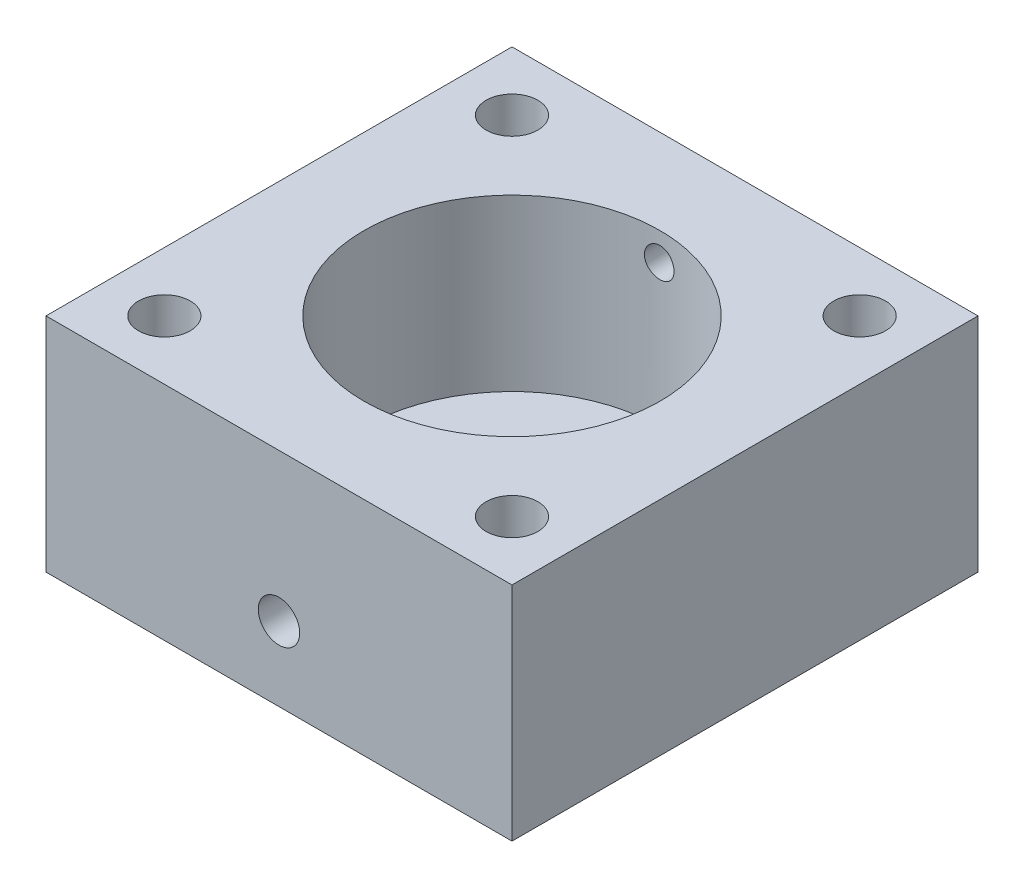
ISO-10303-21;
HEADER;
FILE_DESCRIPTION(('STEP AP214'),'2;1');
FILE_NAME('part.step','',(''),(''),'','','');
FILE_SCHEMA(('AUTOMOTIVE_DESIGN { 1 0 10303 214 1 1 1 1 }'));
ENDSEC;
DATA;
#1=APPLICATION_CONTEXT('core data for automotive mechanical design processes');
#2=APPLICATION_PROTOCOL_DEFINITION('international standard','automotive_design',2000,#1);
#3=PRODUCT_CONTEXT('',#1,'mechanical');
#4=PRODUCT('Part','Part','',(#3));
#5=PRODUCT_RELATED_PRODUCT_CATEGORY('part','',(#4));
#6=PRODUCT_DEFINITION_FORMATION('','',#4);
#7=PRODUCT_DEFINITION_CONTEXT('part definition',#1,'design');
#8=PRODUCT_DEFINITION('design','',#6,#7);
#9=PRODUCT_DEFINITION_SHAPE('','',#8);
#10=(LENGTH_UNIT() NAMED_UNIT(*) SI_UNIT(.MILLI.,.METRE.));
#11=(NAMED_UNIT(*) PLANE_ANGLE_UNIT() SI_UNIT($,.RADIAN.));
#12=(NAMED_UNIT(*) SI_UNIT($,.STERADIAN.) SOLID_ANGLE_UNIT());
#13=UNCERTAINTY_MEASURE_WITH_UNIT(LENGTH_MEASURE(1.E-05),#10,'distance_accuracy_value','');
#14=(GEOMETRIC_REPRESENTATION_CONTEXT(3) GLOBAL_UNCERTAINTY_ASSIGNED_CONTEXT((#13)) GLOBAL_UNIT_ASSIGNED_CONTEXT((#10,
#11,#12)) REPRESENTATION_CONTEXT('',''));
#15=CARTESIAN_POINT('',(0.,0.,0.));
#16=DIRECTION('',(0.,0.,1.));
#17=DIRECTION('',(1.,0.,0.));
#18=AXIS2_PLACEMENT_3D('',#15,#16,#17);
#19=CARTESIAN_POINT('',(0.,13.1236832670913,15.751));
#20=DIRECTION('',(0.,0.,-1.));
#21=DIRECTION('',(-1.,0.,0.));
#22=AXIS2_PLACEMENT_3D('',#19,#20,#21);
#23=CYLINDRICAL_SURFACE('',#22,1.);
#24=CARTESIAN_POINT('',(-1.,13.1236832670913,-9.9498743710662));
#25=CARTESIAN_POINT('',(-0.999997573393512,13.0676637029177,-9.94987502796903));
#26=CARTESIAN_POINT('',(-0.995276858982475,13.0116070986795,-9.95035256994218));
#27=CARTESIAN_POINT('',(-0.976516314763562,12.9010480807978,-9.95221087558119));
#28=CARTESIAN_POINT('',(-0.962466214886435,12.8465474490539,-9.95359263461219));
#29=CARTESIAN_POINT('',(-0.925460116068927,12.7407174478734,-9.95710133047387));
#30=CARTESIAN_POINT('',(-0.902509516293899,12.6893861776999,-9.9592278154679));
#31=CARTESIAN_POINT('',(-0.848364267391102,12.5913154747996,-9.9639858057182));
#32=CARTESIAN_POINT('',(-0.817171255625927,12.5445751326076,-9.96661721064329));
#33=CARTESIAN_POINT('',(-0.747304761998705,12.4568320034338,-9.97209926709899));
#34=CARTESIAN_POINT('',(-0.708607418108261,12.4158482575876,-9.97495060005266));
#35=CARTESIAN_POINT('',(-0.624881715319565,12.3409456580878,-9.98054505235719));
#36=CARTESIAN_POINT('',(-0.579853066906569,12.307027127685,-9.98328816675213));
#37=CARTESIAN_POINT('',(-0.484626361650988,12.2471520100842,-9.98836383155605));
#38=CARTESIAN_POINT('',(-0.43441766252957,12.2212122682977,-9.99069550894647));
#39=CARTESIAN_POINT('',(-0.330329984287511,12.1781388339427,-9.9946781687577));
#40=CARTESIAN_POINT('',(-0.27645109466822,12.1610049267219,-9.99632916777064));
#41=CARTESIAN_POINT('',(-0.16674478274295,12.1360853577381,-9.99875966571026));
#42=CARTESIAN_POINT('',(-0.110924527031582,12.1282684343414,-9.99954207842817));
#43=CARTESIAN_POINT('',(0.00124074068894253,12.1221079979576,-10.0001571559869));
#44=CARTESIAN_POINT('',(0.0575857390544608,12.1237642393451,-9.99998984545273));
#45=CARTESIAN_POINT('',(0.16898884406456,12.1364777397415,-9.99872671311186));
#46=CARTESIAN_POINT('',(0.224050829934979,12.1475013826552,-9.99763421151713));
#47=CARTESIAN_POINT('',(0.331539179504533,12.178584396038,-9.9946472926493));
#48=CARTESIAN_POINT('',(0.383965508957729,12.1986438838789,-9.99275286495953));
#49=CARTESIAN_POINT('',(0.484800314679586,12.2472660303458,-9.98836937483915));
#50=CARTESIAN_POINT('',(0.533201570981649,12.2758435646215,-9.98587927365758));
#51=CARTESIAN_POINT('',(0.624533513174193,12.3406797904277,-9.98058384519407));
#52=CARTESIAN_POINT('',(0.667464038560827,12.3769387072365,-9.97777850866811));
#53=CARTESIAN_POINT('',(0.746832771822689,12.456297496605,-9.97215293467852));
#54=CARTESIAN_POINT('',(0.783241746190345,12.4994266118329,-9.96933268573028));
#55=CARTESIAN_POINT('',(0.848307535357918,12.5912001323021,-9.96400739928222));
#56=CARTESIAN_POINT('',(0.87696433891289,12.6398445455435,-9.96150236223964));
#57=CARTESIAN_POINT('',(0.92571218457323,12.7412902922911,-9.95709089514149));
#58=CARTESIAN_POINT('',(0.94580142057296,12.7940924995142,-9.95518459132555));
#59=CARTESIAN_POINT('',(0.97682073563759,12.902343871706,-9.95218901870938));
#60=CARTESIAN_POINT('',(0.987751093743034,12.9577929559788,-9.95109972501768));
#61=CARTESIAN_POINT('',(1.00010477539196,13.0695074466209,-9.94986580527417));
#62=CARTESIAN_POINT('',(1.00156899664721,13.1257682873562,-9.94971711547603));
#63=CARTESIAN_POINT('',(0.995056246871362,13.2377345329142,-9.95037051354771));
#64=CARTESIAN_POINT('',(0.987079403409754,13.2934399452317,-9.95117258857061));
#65=CARTESIAN_POINT('',(0.96194517450752,13.4025948493697,-9.95363344422402));
#66=CARTESIAN_POINT('',(0.944807127188908,13.456048838186,-9.95529042001345));
#67=CARTESIAN_POINT('',(0.90185671967594,13.5593233188217,-9.95927291038794));
#68=CARTESIAN_POINT('',(0.876044160783588,13.6091437273785,-9.9615984402867));
#69=CARTESIAN_POINT('',(0.816375001423217,13.7039232411201,-9.96666584355714));
#70=CARTESIAN_POINT('',(0.782491299840691,13.7488652090576,-9.96940910814672));
#71=CARTESIAN_POINT('',(0.707680533451174,13.8324383203654,-9.97499832625186));
#72=CARTESIAN_POINT('',(0.666753294248134,13.8710693074314,-9.97784428230866));
#73=CARTESIAN_POINT('',(0.578839804226474,13.9410649004894,-9.98333047849302));
#74=CARTESIAN_POINT('',(0.531832255969452,13.9724028266776,-9.98596994055474));
#75=CARTESIAN_POINT('',(0.433197717417132,14.0267391355978,-9.99073442106631));
#76=CARTESIAN_POINT('',(0.381570790429626,14.0497376325985,-9.99285944656492));
#77=CARTESIAN_POINT('',(0.275256126432816,14.0866970347467,-9.99635210414006));
#78=CARTESIAN_POINT('',(0.22057403764996,14.1006740544166,-9.99772108605649));
#79=CARTESIAN_POINT('',(0.109624813983679,14.1192463366712,-9.99955294613649));
#80=CARTESIAN_POINT('',(0.0533577236922176,14.1238418629254,-10.0000158497656));
#81=CARTESIAN_POINT('',(-0.0589022240757468,14.1235170006514,-9.99998338313269));
#82=CARTESIAN_POINT('',(-0.114895207224528,14.1186380302547,-9.99949218376669));
#83=CARTESIAN_POINT('',(-0.225261888356363,14.0995895214344,-9.99761493577591));
#84=CARTESIAN_POINT('',(-0.279635585068366,14.0854199757184,-9.99622888644873));
#85=CARTESIAN_POINT('',(-0.385219908767743,14.0482040096984,-9.99271723813962));
#86=CARTESIAN_POINT('',(-0.436430966077528,14.0251588001572,-9.99059174003249));
#87=CARTESIAN_POINT('',(-0.534264600154796,13.9708500981744,-9.98583812416296));
#88=CARTESIAN_POINT('',(-0.580887203768559,13.9395866538202,-9.98321000934154));
#89=CARTESIAN_POINT('',(-0.668432724426939,13.8695736480676,-9.97773184669055));
#90=CARTESIAN_POINT('',(-0.709330926219341,13.8307932508465,-9.97488091460699));
#91=CARTESIAN_POINT('',(-0.784057759393143,13.7469079155459,-9.96928590769659));
#92=CARTESIAN_POINT('',(-0.817884691847847,13.7018014619223,-9.96654185867777));
#93=CARTESIAN_POINT('',(-0.877576640424053,13.6064189251714,-9.96146383410601));
#94=CARTESIAN_POINT('',(-0.903421187994835,13.5561299857673,-9.95913091925306));
#95=CARTESIAN_POINT('',(-0.946264708098769,13.4519349758451,-9.95515194762462));
#96=CARTESIAN_POINT('',(-0.963273657889858,13.3980330631656,-9.95350511653359));
#97=CARTESIAN_POINT('',(-0.983721688333529,13.3071355261922,-9.95150007538145));
#98=CARTESIAN_POINT('',(-0.989817712398224,13.2707210157849,-9.95089331935694));
#99=CARTESIAN_POINT('',(-0.997957658605114,13.1974374440488,-9.95008025177663));
#100=CARTESIAN_POINT('',(-1.00000159775726,13.1605683846288,-9.94987393853984));
#101=CARTESIAN_POINT('',(-1.,13.1236832670913,-9.9498743710662));
#102=B_SPLINE_CURVE_WITH_KNOTS('',3,(#24,#25,#26,#27,#28,#29,#30,#31,#32,#33,#34,#35,#36,#37,
#38,#39,#40,#41,#42,#43,#44,#45,#46,#47,#48,#49,#50,#51,#52,#53,#54,#55,#56,#57,#58,#59,#60,#61,
#62,#63,#64,#65,#66,#67,#68,#69,#70,#71,#72,#73,#74,#75,#76,#77,#78,#79,#80,#81,#82,#83,#84,#85,
#86,#87,#88,#89,#90,#91,#92,#93,#94,#95,#96,#97,#98,#99,#100,#101),.UNSPECIFIED.,.T.,.F.,(4,2,2,
2,2,2,2,2,2,2,2,2,2,2,2,2,2,2,2,2,2,2,2,2,2,2,2,2,2,2,2,2,2,2,2,2,2,2,4),(0.,0.167923994436462,
0.336033151821769,0.504040490997473,0.672014480421314,0.840531615299249,1.00905645855253,
1.17793469971292,1.34680882407795,1.5151147089845,1.68341622998232,1.85111631818662,
2.01881858480974,2.18681545466413,2.35481725218529,2.52355425085001,2.69229149427563,
2.86106429117934,3.02983194595033,3.19786996307765,3.3659057096687,3.53358814704527,
3.70127442561047,3.86953189811718,4.03779353723203,4.20666136818118,4.37552688518005,
4.54408992694361,4.71264823113149,4.88047133468483,5.04829456996658,5.21609491995246,
5.38389428810799,5.55239715037988,5.72094045034525,5.88991241070476,6.05869314894001,
6.16926027606046,6.27982693903815),.UNSPECIFIED.);
#103=CARTESIAN_POINT('',(-1.,13.1236832670913,-9.9498743710662));
#104=VERTEX_POINT('',#103);
#105=EDGE_CURVE('E117',#104,#104,#102,.T.);
#106=ORIENTED_EDGE('',*,*,#105,.T.);
#107=EDGE_LOOP('',(#106));
#108=FACE_BOUND('',#107,.T.);
#109=CARTESIAN_POINT('',(0.,13.1236832670913,-13.2499999999999));
#110=DIRECTION('',(0.,0.,-1.));
#111=DIRECTION('',(-1.,0.,0.));
#112=AXIS2_PLACEMENT_3D('',#109,#110,#111);
#113=CIRCLE('',#112,1.);
#114=CARTESIAN_POINT('',(-1.,13.1236832670913,-13.2499999999999));
#115=VERTEX_POINT('',#114);
#116=EDGE_CURVE('E41',#115,#115,#113,.F.);
#117=ORIENTED_EDGE('',*,*,#116,.F.);
#118=EDGE_LOOP('',(#117));
#119=FACE_BOUND('',#118,.T.);
#120=ADVANCED_FACE('F37',(#108,#119),#23,.F.);
#121=CARTESIAN_POINT('',(0.,5.,-15.7509999999999));
#122=DIRECTION('',(0.,0.,1.));
#123=DIRECTION('',(1.,0.,0.));
#124=AXIS2_PLACEMENT_3D('',#121,#122,#123);
#125=CYLINDRICAL_SURFACE('',#124,1.);
#126=CARTESIAN_POINT('',(1.,5.,9.9498743710662));
#127=CARTESIAN_POINT('',(0.999997573393512,4.9439804358264,9.94987502796903));
#128=CARTESIAN_POINT('',(0.995276858982475,4.88792383158816,9.95035256994218));
#129=CARTESIAN_POINT('',(0.976516314763562,4.77736481370647,9.95221087558119));
#130=CARTESIAN_POINT('',(0.962466214886435,4.72286418196251,9.95359263461219));
#131=CARTESIAN_POINT('',(0.925460116068926,4.61703418078209,9.95710133047387));
#132=CARTESIAN_POINT('',(0.902509516293899,4.56570291060856,9.9592278154679));
#133=CARTESIAN_POINT('',(0.848364267391101,4.46763220770825,9.9639858057182));
#134=CARTESIAN_POINT('',(0.817171255625926,4.42089186551628,9.96661721064329));
#135=CARTESIAN_POINT('',(0.747304761998704,4.3331487363425,9.97209926709899));
#136=CARTESIAN_POINT('',(0.708607418108259,4.29216499049622,9.97495060005266));
#137=CARTESIAN_POINT('',(0.624881715319564,4.21726239099643,9.98054505235719));
#138=CARTESIAN_POINT('',(0.579853066906569,4.18334386059369,9.98328816675213));
#139=CARTESIAN_POINT('',(0.484626361650988,4.12346874299285,9.98836383155605));
#140=CARTESIAN_POINT('',(0.434417662529569,4.09752900120634,9.99069550894647));
#141=CARTESIAN_POINT('',(0.33032998428751,4.05445556685132,9.99467816875771));
#142=CARTESIAN_POINT('',(0.276451094668219,4.03732165963053,9.99632916777064));
#143=CARTESIAN_POINT('',(0.16674478274295,4.01240209064675,9.99875966571026));
#144=CARTESIAN_POINT('',(0.110924527031581,4.00458516725005,9.99954207842817));
#145=CARTESIAN_POINT('',(-0.00124074068894321,3.99842473086628,10.0001571559869));
#146=CARTESIAN_POINT('',(-0.0575857390544615,4.00008097225373,9.99998984545273));
#147=CARTESIAN_POINT('',(-0.16898884406456,4.01279447265016,9.99872671311186));
#148=CARTESIAN_POINT('',(-0.224050829934979,4.02381811556389,9.99763421151713));
#149=CARTESIAN_POINT('',(-0.331539179504533,4.05490112894662,9.9946472926493));
#150=CARTESIAN_POINT('',(-0.383965508957729,4.07496061678757,9.99275286495953));
#151=CARTESIAN_POINT('',(-0.484800314679586,4.12358276325444,9.98836937483915));
#152=CARTESIAN_POINT('',(-0.53320157098165,4.15216029753016,9.98587927365758));
#153=CARTESIAN_POINT('',(-0.624533513174194,4.21699652333637,9.98058384519407));
#154=CARTESIAN_POINT('',(-0.667464038560828,4.25325544014518,9.97777850866811));
#155=CARTESIAN_POINT('',(-0.746832771822689,4.33261422951365,9.97215293467852));
#156=CARTESIAN_POINT('',(-0.783241746190344,4.37574334474158,9.96933268573028));
#157=CARTESIAN_POINT('',(-0.848307535357917,4.46751686521078,9.96400739928222));
#158=CARTESIAN_POINT('',(-0.876964338912889,4.51616127845214,9.96150236223964));
#159=CARTESIAN_POINT('',(-0.92571218457323,4.61760702519979,9.95709089514149));
#160=CARTESIAN_POINT('',(-0.94580142057296,4.67040923242289,9.95518459132555));
#161=CARTESIAN_POINT('',(-0.976820735637589,4.77866060461469,9.95218901870938));
#162=CARTESIAN_POINT('',(-0.987751093743033,4.83410968888744,9.95109972501768));
#163=CARTESIAN_POINT('',(-1.00010477539196,4.94582417952951,9.94986580527417));
#164=CARTESIAN_POINT('',(-1.00156899664721,5.00208502026483,9.94971711547603));
#165=CARTESIAN_POINT('',(-0.995056246871362,5.11405126582286,9.95037051354771));
#166=CARTESIAN_POINT('',(-0.987079403409754,5.16975667814037,9.95117258857061));
#167=CARTESIAN_POINT('',(-0.961945174507519,5.27891158227834,9.95363344422402));
#168=CARTESIAN_POINT('',(-0.944807127188908,5.33236557109466,9.95529042001345));
#169=CARTESIAN_POINT('',(-0.901856719675939,5.43564005173031,9.95927291038795));
#170=CARTESIAN_POINT('',(-0.876044160783587,5.48546046028718,9.9615984402867));
#171=CARTESIAN_POINT('',(-0.816375001423217,5.58023997402878,9.96666584355714));
#172=CARTESIAN_POINT('',(-0.782491299840691,5.62518194196625,9.96940910814672));
#173=CARTESIAN_POINT('',(-0.707680533451174,5.70875505327407,9.97499832625186));
#174=CARTESIAN_POINT('',(-0.666753294248134,5.74738604034008,9.97784428230866));
#175=CARTESIAN_POINT('',(-0.578839804226473,5.81738163339809,9.98333047849302));
#176=CARTESIAN_POINT('',(-0.531832255969451,5.84871955958622,9.98596994055474));
#177=CARTESIAN_POINT('',(-0.433197717417131,5.90305586850641,9.99073442106631));
#178=CARTESIAN_POINT('',(-0.381570790429625,5.9260543655071,9.99285944656492));
#179=CARTESIAN_POINT('',(-0.275256126432815,5.96301376765534,9.99635210414006));
#180=CARTESIAN_POINT('',(-0.22057403764996,5.97699078732521,9.99772108605649));
#181=CARTESIAN_POINT('',(-0.109624813983679,5.99556306957984,9.99955294613649));
#182=CARTESIAN_POINT('',(-0.0533577236922177,6.00015859583404,10.0000158497656));
#183=CARTESIAN_POINT('',(0.0589022240757466,5.99983373356006,9.99998338313269));
#184=CARTESIAN_POINT('',(0.114895207224528,5.99495476316334,9.99949218376669));
#185=CARTESIAN_POINT('',(0.225261888356363,5.97590625434302,9.99761493577591));
#186=CARTESIAN_POINT('',(0.279635585068366,5.96173670862703,9.99622888644873));
#187=CARTESIAN_POINT('',(0.385219908767743,5.92452074260707,9.99271723813962));
#188=CARTESIAN_POINT('',(0.436430966077528,5.90147553306584,9.99059174003249));
#189=CARTESIAN_POINT('',(0.534264600154795,5.84716683108302,9.98583812416296));
#190=CARTESIAN_POINT('',(0.580887203768558,5.81590338672888,9.98321000934154));
#191=CARTESIAN_POINT('',(0.668432724426938,5.74589038097625,9.97773184669055));
#192=CARTESIAN_POINT('',(0.70933092621934,5.7071099837552,9.97488091460699));
#193=CARTESIAN_POINT('',(0.784057759393142,5.62322464845455,9.96928590769659));
#194=CARTESIAN_POINT('',(0.817884691847847,5.57811819483092,9.96654185867777));
#195=CARTESIAN_POINT('',(0.877576640424053,5.48273565808009,9.96146383410601));
#196=CARTESIAN_POINT('',(0.903421187994834,5.43244671867595,9.95913091925306));
#197=CARTESIAN_POINT('',(0.946264708098768,5.32825170875377,9.95515194762462));
#198=CARTESIAN_POINT('',(0.963273657889857,5.27434979607429,9.95350511653359));
#199=CARTESIAN_POINT('',(0.983721688333529,5.18345225910088,9.95150007538145));
#200=CARTESIAN_POINT('',(0.989817712398225,5.14703774869357,9.95089331935694));
#201=CARTESIAN_POINT('',(0.997957658605114,5.07375417695745,9.95008025177663));
#202=CARTESIAN_POINT('',(1.00000159775726,5.03688511753741,9.94987393853984));
#203=CARTESIAN_POINT('',(1.,5.,9.9498743710662));
#204=B_SPLINE_CURVE_WITH_KNOTS('',3,(#126,#127,#128,#129,#130,#131,#132,#133,#134,#135,#136,
#137,#138,#139,#140,#141,#142,#143,#144,#145,#146,#147,#148,#149,#150,#151,#152,#153,#154,#155,
#156,#157,#158,#159,#160,#161,#162,#163,#164,#165,#166,#167,#168,#169,#170,#171,#172,#173,#174,
#175,#176,#177,#178,#179,#180,#181,#182,#183,#184,#185,#186,#187,#188,#189,#190,#191,#192,#193,
#194,#195,#196,#197,#198,#199,#200,#201,#202,#203),.UNSPECIFIED.,.T.,.F.,(4,2,2,2,2,2,2,2,2,2,2,
2,2,2,2,2,2,2,2,2,2,2,2,2,2,2,2,2,2,2,2,2,2,2,2,2,2,2,4),(0.,0.167923994436462,
0.336033151821769,0.504040490997473,0.672014480421314,0.84053161529925,1.00905645855253,
1.17793469971292,1.34680882407795,1.5151147089845,1.68341622998232,1.85111631818662,
2.01881858480974,2.18681545466413,2.35481725218529,2.52355425085001,2.69229149427563,
2.86106429117934,3.02983194595033,3.19786996307765,3.3659057096687,3.53358814704527,
3.70127442561047,3.86953189811718,4.03779353723203,4.20666136818118,4.37552688518005,
4.54408992694361,4.71264823113149,4.88047133468483,5.04829456996658,5.21609491995246,
5.38389428810799,5.55239715037988,5.72094045034525,5.88991241070476,6.05869314894001,
6.16926027606046,6.27982693903815),.UNSPECIFIED.);
#205=CARTESIAN_POINT('',(1.,5.,9.9498743710662));
#206=VERTEX_POINT('',#205);
#207=EDGE_CURVE('E122',#206,#206,#204,.T.);
#208=ORIENTED_EDGE('',*,*,#207,.T.);
#209=EDGE_LOOP('',(#208));
#210=FACE_BOUND('',#209,.T.);
#211=CARTESIAN_POINT('',(0.,5.,13.25));
#212=DIRECTION('',(0.,0.,1.));
#213=DIRECTION('',(1.,0.,0.));
#214=AXIS2_PLACEMENT_3D('',#211,#212,#213);
#215=CIRCLE('',#214,1.);
#216=CARTESIAN_POINT('',(1.,5.,13.25));
#217=VERTEX_POINT('',#216);
#218=EDGE_CURVE('E115',#217,#217,#215,.F.);
#219=ORIENTED_EDGE('',*,*,#218,.F.);
#220=EDGE_LOOP('',(#219));
#221=FACE_BOUND('',#220,.T.);
#222=ADVANCED_FACE('F167',(#210,#221),#125,.F.);
#223=CARTESIAN_POINT('',(-15.75,15.,15.75));
#224=DIRECTION('',(-1.,0.,0.));
#225=DIRECTION('',(0.,0.,1.));
#226=AXIS2_PLACEMENT_3D('',#223,#224,#225);
#227=PLANE('',#226);
#228=DIRECTION('',(0.,0.,-1.));
#229=VECTOR('',#228,1.);
#230=CARTESIAN_POINT('',(-15.75,0.,15.75));
#231=LINE('',#230,#229);
#232=CARTESIAN_POINT('',(-15.75,0.,15.75));
#233=VERTEX_POINT('',#232);
#234=CARTESIAN_POINT('',(-15.75,0.,-15.7499999999999));
#235=VERTEX_POINT('',#234);
#236=EDGE_CURVE('E106',#233,#235,#231,.T.);
#237=ORIENTED_EDGE('',*,*,#236,.F.);
#238=DIRECTION('',(0.,-1.,0.));
#239=VECTOR('',#238,1.);
#240=CARTESIAN_POINT('',(-15.75,15.,15.75));
#241=LINE('',#240,#239);
#242=CARTESIAN_POINT('',(-15.75,15.,15.75));
#243=VERTEX_POINT('',#242);
#244=EDGE_CURVE('E11',#243,#233,#241,.T.);
#245=ORIENTED_EDGE('',*,*,#244,.F.);
#246=DIRECTION('',(0.,0.,-1.));
#247=VECTOR('',#246,1.);
#248=CARTESIAN_POINT('',(-15.75,15.,15.75));
#249=LINE('',#248,#247);
#250=CARTESIAN_POINT('',(-15.75,15.,-15.7499999999999));
#251=VERTEX_POINT('',#250);
#252=EDGE_CURVE('E100',#243,#251,#249,.T.);
#253=ORIENTED_EDGE('',*,*,#252,.T.);
#254=DIRECTION('',(0.,-1.,0.));
#255=VECTOR('',#254,1.);
#256=CARTESIAN_POINT('',(-15.75,15.,-15.7499999999999));
#257=LINE('',#256,#255);
#258=EDGE_CURVE('E79',#251,#235,#257,.T.);
#259=ORIENTED_EDGE('',*,*,#258,.T.);
#260=EDGE_LOOP('',(#237,#245,#253,#259));
#261=FACE_BOUND('',#260,.T.);
#262=ADVANCED_FACE('F39',(#261),#227,.T.);
#263=CARTESIAN_POINT('',(-15.75,15.,15.75));
#264=DIRECTION('',(0.,0.,-1.));
#265=DIRECTION('',(-1.,0.,0.));
#266=AXIS2_PLACEMENT_3D('',#263,#264,#265);
#267=PLANE('',#266);
#268=CARTESIAN_POINT('',(0.,5.,15.75));
#269=DIRECTION('',(0.,0.,1.));
#270=DIRECTION('',(1.,0.,0.));
#271=AXIS2_PLACEMENT_3D('',#268,#269,#270);
#272=CIRCLE('',#271,1.4);
#273=CARTESIAN_POINT('',(1.4,5.,15.75));
#274=VERTEX_POINT('',#273);
#275=EDGE_CURVE('E125',#274,#274,#272,.T.);
#276=ORIENTED_EDGE('',*,*,#275,.F.);
#277=EDGE_LOOP('',(#276));
#278=FACE_BOUND('',#277,.T.);
#279=DIRECTION('',(1.,0.,0.));
#280=VECTOR('',#279,1.);
#281=CARTESIAN_POINT('',(-15.75,0.,15.75));
#282=LINE('',#281,#280);
#283=CARTESIAN_POINT('',(15.75,0.,15.75));
#284=VERTEX_POINT('',#283);
#285=EDGE_CURVE('E71',#233,#284,#282,.T.);
#286=ORIENTED_EDGE('',*,*,#285,.T.);
#287=DIRECTION('',(0.,-1.,0.));
#288=VECTOR('',#287,1.);
#289=CARTESIAN_POINT('',(15.75,15.,15.75));
#290=LINE('',#289,#288);
#291=CARTESIAN_POINT('',(15.75,15.,15.75));
#292=VERTEX_POINT('',#291);
#293=EDGE_CURVE('E47',#292,#284,#290,.T.);
#294=ORIENTED_EDGE('',*,*,#293,.F.);
#295=DIRECTION('',(1.,0.,0.));
#296=VECTOR('',#295,1.);
#297=CARTESIAN_POINT('',(-15.75,15.,15.75));
#298=LINE('',#297,#296);
#299=EDGE_CURVE('E89',#243,#292,#298,.T.);
#300=ORIENTED_EDGE('',*,*,#299,.F.);
#301=ORIENTED_EDGE('',*,*,#244,.T.);
#302=EDGE_LOOP('',(#286,#294,#300,#301));
#303=FACE_BOUND('',#302,.T.);
#304=ADVANCED_FACE('F191',(#278,#303),#267,.F.);
#305=CARTESIAN_POINT('',(15.75,15.,15.75));
#306=DIRECTION('',(-1.,0.,0.));
#307=DIRECTION('',(0.,0.,1.));
#308=AXIS2_PLACEMENT_3D('',#305,#306,#307);
#309=PLANE('',#308);
#310=DIRECTION('',(0.,0.,-1.));
#311=VECTOR('',#310,1.);
#312=CARTESIAN_POINT('',(15.75,0.,15.75));
#313=LINE('',#312,#311);
#314=CARTESIAN_POINT('',(15.75,0.,-15.7499999999999));
#315=VERTEX_POINT('',#314);
#316=EDGE_CURVE('E96',#284,#315,#313,.T.);
#317=ORIENTED_EDGE('',*,*,#316,.T.);
#318=DIRECTION('',(0.,-1.,0.));
#319=VECTOR('',#318,1.);
#320=CARTESIAN_POINT('',(15.75,15.,-15.7499999999999));
#321=LINE('',#320,#319);
#322=CARTESIAN_POINT('',(15.75,15.,-15.7499999999999));
#323=VERTEX_POINT('',#322);
#324=EDGE_CURVE('E93',#323,#315,#321,.T.);
#325=ORIENTED_EDGE('',*,*,#324,.F.);
#326=DIRECTION('',(0.,0.,-1.));
#327=VECTOR('',#326,1.);
#328=CARTESIAN_POINT('',(15.75,15.,15.75));
#329=LINE('',#328,#327);
#330=EDGE_CURVE('E84',#292,#323,#329,.T.);
#331=ORIENTED_EDGE('',*,*,#330,.F.);
#332=ORIENTED_EDGE('',*,*,#293,.T.);
#333=EDGE_LOOP('',(#317,#325,#331,#332));
#334=FACE_BOUND('',#333,.T.);
#335=ADVANCED_FACE('F94',(#334),#309,.F.);
#336=CARTESIAN_POINT('',(-15.75,15.,-15.7499999999999));
#337=DIRECTION('',(0.,0.,-1.));
#338=DIRECTION('',(-1.,0.,0.));
#339=AXIS2_PLACEMENT_3D('',#336,#337,#338);
#340=PLANE('',#339);
#341=CARTESIAN_POINT('',(0.,13.1236832670913,-15.7499999999999));
#342=DIRECTION('',(0.,0.,-1.));
#343=DIRECTION('',(-1.,0.,0.));
#344=AXIS2_PLACEMENT_3D('',#341,#342,#343);
#345=CIRCLE('',#344,1.4);
#346=CARTESIAN_POINT('',(-1.4,13.1236832670913,-15.7499999999999));
#347=VERTEX_POINT('',#346);
#348=EDGE_CURVE('E132',#347,#347,#345,.T.);
#349=ORIENTED_EDGE('',*,*,#348,.F.);
#350=EDGE_LOOP('',(#349));
#351=FACE_BOUND('',#350,.T.);
#352=DIRECTION('',(1.,0.,0.));
#353=VECTOR('',#352,1.);
#354=CARTESIAN_POINT('',(-15.75,0.,-15.7499999999999));
#355=LINE('',#354,#353);
#356=EDGE_CURVE('E109',#235,#315,#355,.T.);
#357=ORIENTED_EDGE('',*,*,#356,.F.);
#358=ORIENTED_EDGE('',*,*,#258,.F.);
#359=DIRECTION('',(1.,0.,0.));
#360=VECTOR('',#359,1.);
#361=CARTESIAN_POINT('',(-15.75,15.,-15.7499999999999));
#362=LINE('',#361,#360);
#363=EDGE_CURVE('E88',#251,#323,#362,.T.);
#364=ORIENTED_EDGE('',*,*,#363,.T.);
#365=ORIENTED_EDGE('',*,*,#324,.T.);
#366=EDGE_LOOP('',(#357,#358,#364,#365));
#367=FACE_BOUND('',#366,.T.);
#368=ADVANCED_FACE('F99',(#351,#367),#340,.T.);
#369=CARTESIAN_POINT('',(0.,15.,0.));
#370=DIRECTION('',(0.,-1.,0.));
#371=DIRECTION('',(0.,0.,-1.));
#372=AXIS2_PLACEMENT_3D('',#369,#370,#371);
#373=PLANE('',#372);
#374=CARTESIAN_POINT('',(-11.75,15.,-11.7499999999999));
#375=DIRECTION('',(0.,1.,0.));
#376=DIRECTION('',(0.,0.,-1.));
#377=AXIS2_PLACEMENT_3D('',#374,#375,#376);
#378=CIRCLE('',#377,1.75);
#379=CARTESIAN_POINT('',(-11.75,15.,-13.4999999999999));
#380=VERTEX_POINT('',#379);
#381=EDGE_CURVE('E246',#380,#380,#378,.T.);
#382=ORIENTED_EDGE('',*,*,#381,.F.);
#383=EDGE_LOOP('',(#382));
#384=FACE_BOUND('',#383,.T.);
#385=CARTESIAN_POINT('',(11.75,15.,-11.7499999999999));
#386=DIRECTION('',(0.,1.,0.));
#387=DIRECTION('',(0.,0.,1.));
#388=AXIS2_PLACEMENT_3D('',#385,#386,#387);
#389=CIRCLE('',#388,1.75);
#390=CARTESIAN_POINT('',(11.75,15.,-9.99999999999993));
#391=VERTEX_POINT('',#390);
#392=EDGE_CURVE('E238',#391,#391,#389,.T.);
#393=ORIENTED_EDGE('',*,*,#392,.F.);
#394=EDGE_LOOP('',(#393));
#395=FACE_BOUND('',#394,.T.);
#396=CARTESIAN_POINT('',(11.75,15.,11.75));
#397=DIRECTION('',(0.,1.,0.));
#398=DIRECTION('',(0.,0.,-1.));
#399=AXIS2_PLACEMENT_3D('',#396,#397,#398);
#400=CIRCLE('',#399,1.75);
#401=CARTESIAN_POINT('',(11.75,15.,10.));
#402=VERTEX_POINT('',#401);
#403=EDGE_CURVE('E232',#402,#402,#400,.T.);
#404=ORIENTED_EDGE('',*,*,#403,.F.);
#405=EDGE_LOOP('',(#404));
#406=FACE_BOUND('',#405,.T.);
#407=CARTESIAN_POINT('',(-11.75,15.,11.75));
#408=DIRECTION('',(0.,1.,0.));
#409=DIRECTION('',(0.,0.,1.));
#410=AXIS2_PLACEMENT_3D('',#407,#408,#409);
#411=CIRCLE('',#410,1.75);
#412=CARTESIAN_POINT('',(-11.75,15.,13.5));
#413=VERTEX_POINT('',#412);
#414=EDGE_CURVE('E236',#413,#413,#411,.T.);
#415=ORIENTED_EDGE('',*,*,#414,.F.);
#416=EDGE_LOOP('',(#415));
#417=FACE_BOUND('',#416,.T.);
#418=CARTESIAN_POINT('',(0.,15.,0.));
#419=DIRECTION('',(0.,1.,0.));
#420=DIRECTION('',(0.,0.,1.));
#421=AXIS2_PLACEMENT_3D('',#418,#419,#420);
#422=CIRCLE('',#421,10.);
#423=CARTESIAN_POINT('',(0.,15.,10.));
#424=VERTEX_POINT('',#423);
#425=EDGE_CURVE('E252',#424,#424,#422,.T.);
#426=ORIENTED_EDGE('',*,*,#425,.F.);
#427=EDGE_LOOP('',(#426));
#428=FACE_BOUND('',#427,.T.);
#429=ORIENTED_EDGE('',*,*,#252,.F.);
#430=ORIENTED_EDGE('',*,*,#299,.T.);
#431=ORIENTED_EDGE('',*,*,#330,.T.);
#432=ORIENTED_EDGE('',*,*,#363,.F.);
#433=EDGE_LOOP('',(#429,#430,#431,#432));
#434=FACE_BOUND('',#433,.T.);
#435=ADVANCED_FACE('F87',(#384,#395,#406,#417,#428,#434),#373,.F.);
#436=CARTESIAN_POINT('',(0.,0.,0.));
#437=DIRECTION('',(0.,-1.,0.));
#438=DIRECTION('',(0.,0.,-1.));
#439=AXIS2_PLACEMENT_3D('',#436,#437,#438);
#440=PLANE('',#439);
#441=CARTESIAN_POINT('',(-11.75,0.,-11.7499999999999));
#442=DIRECTION('',(0.,1.,0.));
#443=DIRECTION('',(0.,0.,-1.));
#444=AXIS2_PLACEMENT_3D('',#441,#442,#443);
#445=CIRCLE('',#444,1.75);
#446=CARTESIAN_POINT('',(-11.75,0.,-13.4999999999999));
#447=VERTEX_POINT('',#446);
#448=EDGE_CURVE('E243',#447,#447,#445,.T.);
#449=ORIENTED_EDGE('',*,*,#448,.T.);
#450=EDGE_LOOP('',(#449));
#451=FACE_BOUND('',#450,.T.);
#452=CARTESIAN_POINT('',(11.75,0.,-11.7499999999999));
#453=DIRECTION('',(0.,1.,0.));
#454=DIRECTION('',(0.,0.,1.));
#455=AXIS2_PLACEMENT_3D('',#452,#453,#454);
#456=CIRCLE('',#455,1.75);
#457=CARTESIAN_POINT('',(11.75,0.,-9.99999999999993));
#458=VERTEX_POINT('',#457);
#459=EDGE_CURVE('E234',#458,#458,#456,.T.);
#460=ORIENTED_EDGE('',*,*,#459,.T.);
#461=EDGE_LOOP('',(#460));
#462=FACE_BOUND('',#461,.T.);
#463=CARTESIAN_POINT('',(11.75,0.,11.75));
#464=DIRECTION('',(0.,1.,0.));
#465=DIRECTION('',(0.,0.,-1.));
#466=AXIS2_PLACEMENT_3D('',#463,#464,#465);
#467=CIRCLE('',#466,1.75);
#468=CARTESIAN_POINT('',(11.75,0.,10.));
#469=VERTEX_POINT('',#468);
#470=EDGE_CURVE('E229',#469,#469,#467,.T.);
#471=ORIENTED_EDGE('',*,*,#470,.T.);
#472=EDGE_LOOP('',(#471));
#473=FACE_BOUND('',#472,.T.);
#474=CARTESIAN_POINT('',(-11.75,0.,11.75));
#475=DIRECTION('',(0.,1.,0.));
#476=DIRECTION('',(0.,0.,1.));
#477=AXIS2_PLACEMENT_3D('',#474,#475,#476);
#478=CIRCLE('',#477,1.75);
#479=CARTESIAN_POINT('',(-11.75,0.,13.5));
#480=VERTEX_POINT('',#479);
#481=EDGE_CURVE('E249',#480,#480,#478,.T.);
#482=ORIENTED_EDGE('',*,*,#481,.T.);
#483=EDGE_LOOP('',(#482));
#484=FACE_BOUND('',#483,.T.);
#485=ORIENTED_EDGE('',*,*,#236,.T.);
#486=ORIENTED_EDGE('',*,*,#356,.T.);
#487=ORIENTED_EDGE('',*,*,#316,.F.);
#488=ORIENTED_EDGE('',*,*,#285,.F.);
#489=EDGE_LOOP('',(#485,#486,#487,#488));
#490=FACE_BOUND('',#489,.T.);
#491=ADVANCED_FACE('F188',(#451,#462,#473,#484,#490),#440,.T.);
#492=CARTESIAN_POINT('',(0.,3.5,0.));
#493=DIRECTION('',(0.,1.,0.));
#494=DIRECTION('',(0.,0.,1.));
#495=AXIS2_PLACEMENT_3D('',#492,#493,#494);
#496=CYLINDRICAL_SURFACE('',#495,10.);
#497=ORIENTED_EDGE('',*,*,#105,.F.);
#498=EDGE_LOOP('',(#497));
#499=FACE_BOUND('',#498,.T.);
#500=ORIENTED_EDGE('',*,*,#207,.F.);
#501=EDGE_LOOP('',(#500));
#502=FACE_BOUND('',#501,.T.);
#503=CARTESIAN_POINT('',(0.,3.5,0.));
#504=DIRECTION('',(0.,1.,0.));
#505=DIRECTION('',(0.,0.,1.));
#506=AXIS2_PLACEMENT_3D('',#503,#504,#505);
#507=CIRCLE('',#506,10.);
#508=CARTESIAN_POINT('',(0.,3.5,10.));
#509=VERTEX_POINT('',#508);
#510=EDGE_CURVE('E110',#509,#509,#507,.T.);
#511=ORIENTED_EDGE('',*,*,#510,.F.);
#512=EDGE_LOOP('',(#511));
#513=FACE_BOUND('',#512,.T.);
#514=ORIENTED_EDGE('',*,*,#425,.T.);
#515=EDGE_LOOP('',(#514));
#516=FACE_BOUND('',#515,.T.);
#517=ADVANCED_FACE('F198',(#499,#502,#513,#516),#496,.F.);
#518=CARTESIAN_POINT('',(0.,3.5,0.));
#519=DIRECTION('',(0.,1.,0.));
#520=DIRECTION('',(0.,0.,1.));
#521=AXIS2_PLACEMENT_3D('',#518,#519,#520);
#522=PLANE('',#521);
#523=ORIENTED_EDGE('',*,*,#510,.T.);
#524=EDGE_LOOP('',(#523));
#525=FACE_BOUND('',#524,.T.);
#526=ADVANCED_FACE('F203',(#525),#522,.T.);
#527=CARTESIAN_POINT('',(-11.75,0.,11.75));
#528=DIRECTION('',(0.,1.,0.));
#529=DIRECTION('',(0.,0.,1.));
#530=AXIS2_PLACEMENT_3D('',#527,#528,#529);
#531=CYLINDRICAL_SURFACE('',#530,1.75);
#532=ORIENTED_EDGE('',*,*,#481,.F.);
#533=EDGE_LOOP('',(#532));
#534=FACE_BOUND('',#533,.T.);
#535=ORIENTED_EDGE('',*,*,#414,.T.);
#536=EDGE_LOOP('',(#535));
#537=FACE_BOUND('',#536,.T.);
#538=ADVANCED_FACE('F207',(#534,#537),#531,.F.);
#539=CARTESIAN_POINT('',(11.75,0.,11.75));
#540=DIRECTION('',(0.,1.,0.));
#541=DIRECTION('',(0.,0.,1.));
#542=AXIS2_PLACEMENT_3D('',#539,#540,#541);
#543=CYLINDRICAL_SURFACE('',#542,1.75);
#544=ORIENTED_EDGE('',*,*,#470,.F.);
#545=EDGE_LOOP('',(#544));
#546=FACE_BOUND('',#545,.T.);
#547=ORIENTED_EDGE('',*,*,#403,.T.);
#548=EDGE_LOOP('',(#547));
#549=FACE_BOUND('',#548,.T.);
#550=ADVANCED_FACE('F211',(#546,#549),#543,.F.);
#551=CARTESIAN_POINT('',(11.75,0.,-11.7499999999999));
#552=DIRECTION('',(0.,1.,0.));
#553=DIRECTION('',(0.,0.,1.));
#554=AXIS2_PLACEMENT_3D('',#551,#552,#553);
#555=CYLINDRICAL_SURFACE('',#554,1.75);
#556=ORIENTED_EDGE('',*,*,#459,.F.);
#557=EDGE_LOOP('',(#556));
#558=FACE_BOUND('',#557,.T.);
#559=ORIENTED_EDGE('',*,*,#392,.T.);
#560=EDGE_LOOP('',(#559));
#561=FACE_BOUND('',#560,.T.);
#562=ADVANCED_FACE('F215',(#558,#561),#555,.F.);
#563=CARTESIAN_POINT('',(-11.75,0.,-11.7499999999999));
#564=DIRECTION('',(0.,1.,0.));
#565=DIRECTION('',(0.,0.,1.));
#566=AXIS2_PLACEMENT_3D('',#563,#564,#565);
#567=CYLINDRICAL_SURFACE('',#566,1.75);
#568=ORIENTED_EDGE('',*,*,#448,.F.);
#569=EDGE_LOOP('',(#568));
#570=FACE_BOUND('',#569,.T.);
#571=ORIENTED_EDGE('',*,*,#381,.T.);
#572=EDGE_LOOP('',(#571));
#573=FACE_BOUND('',#572,.T.);
#574=ADVANCED_FACE('F155',(#570,#573),#567,.F.);
#575=CARTESIAN_POINT('',(0.,5.,13.25));
#576=DIRECTION('',(0.,0.,1.));
#577=DIRECTION('',(1.,0.,0.));
#578=AXIS2_PLACEMENT_3D('',#575,#576,#577);
#579=PLANE('',#578);
#580=CARTESIAN_POINT('',(0.,5.,13.25));
#581=DIRECTION('',(0.,0.,1.));
#582=DIRECTION('',(1.,0.,0.));
#583=AXIS2_PLACEMENT_3D('',#580,#581,#582);
#584=CIRCLE('',#583,1.4);
#585=CARTESIAN_POINT('',(1.4,5.,13.25));
#586=VERTEX_POINT('',#585);
#587=EDGE_CURVE('E118',#586,#586,#584,.T.);
#588=ORIENTED_EDGE('',*,*,#587,.T.);
#589=EDGE_LOOP('',(#588));
#590=FACE_BOUND('',#589,.T.);
#591=ORIENTED_EDGE('',*,*,#218,.T.);
#592=EDGE_LOOP('',(#591));
#593=FACE_BOUND('',#592,.T.);
#594=ADVANCED_FACE('F151',(#590,#593),#579,.T.);
#595=CARTESIAN_POINT('',(0.,5.,13.25));
#596=DIRECTION('',(0.,0.,1.));
#597=DIRECTION('',(1.,0.,0.));
#598=AXIS2_PLACEMENT_3D('',#595,#596,#597);
#599=CYLINDRICAL_SURFACE('',#598,1.4);
#600=ORIENTED_EDGE('',*,*,#587,.F.);
#601=EDGE_LOOP('',(#600));
#602=FACE_BOUND('',#601,.T.);
#603=ORIENTED_EDGE('',*,*,#275,.T.);
#604=EDGE_LOOP('',(#603));
#605=FACE_BOUND('',#604,.T.);
#606=ADVANCED_FACE('F147',(#602,#605),#599,.F.);
#607=CARTESIAN_POINT('',(0.,13.1236832670913,-13.2499999999999));
#608=DIRECTION('',(0.,0.,-1.));
#609=DIRECTION('',(-1.,0.,0.));
#610=AXIS2_PLACEMENT_3D('',#607,#608,#609);
#611=PLANE('',#610);
#612=CARTESIAN_POINT('',(0.,13.1236832670913,-13.2499999999999));
#613=DIRECTION('',(0.,0.,-1.));
#614=DIRECTION('',(-1.,0.,0.));
#615=AXIS2_PLACEMENT_3D('',#612,#613,#614);
#616=CIRCLE('',#615,1.4);
#617=CARTESIAN_POINT('',(-1.4,13.1236832670913,-13.2499999999999));
#618=VERTEX_POINT('',#617);
#619=EDGE_CURVE('E177',#618,#618,#616,.T.);
#620=ORIENTED_EDGE('',*,*,#619,.T.);
#621=EDGE_LOOP('',(#620));
#622=FACE_BOUND('',#621,.T.);
#623=ORIENTED_EDGE('',*,*,#116,.T.);
#624=EDGE_LOOP('',(#623));
#625=FACE_BOUND('',#624,.T.);
#626=ADVANCED_FACE('F150',(#622,#625),#611,.T.);
#627=CARTESIAN_POINT('',(0.,13.1236832670913,-13.2499999999999));
#628=DIRECTION('',(0.,0.,-1.));
#629=DIRECTION('',(-1.,0.,0.));
#630=AXIS2_PLACEMENT_3D('',#627,#628,#629);
#631=CYLINDRICAL_SURFACE('',#630,1.4);
#632=ORIENTED_EDGE('',*,*,#619,.F.);
#633=EDGE_LOOP('',(#632));
#634=FACE_BOUND('',#633,.T.);
#635=ORIENTED_EDGE('',*,*,#348,.T.);
#636=EDGE_LOOP('',(#635));
#637=FACE_BOUND('',#636,.T.);
#638=ADVANCED_FACE('F156',(#634,#637),#631,.F.);
#639=CLOSED_SHELL('',(#120,#222,#262,#304,#335,#368,#435,#491,#517,#526,#538,#550,#562,#574,
#594,#606,#626,#638));
#640=MANIFOLD_SOLID_BREP('B2',#639);
#641=ADVANCED_BREP_SHAPE_REPRESENTATION('',(#18,#640),#14);
#642=SHAPE_DEFINITION_REPRESENTATION(#9,#641);
ENDSEC;
END-ISO-10303-21;
